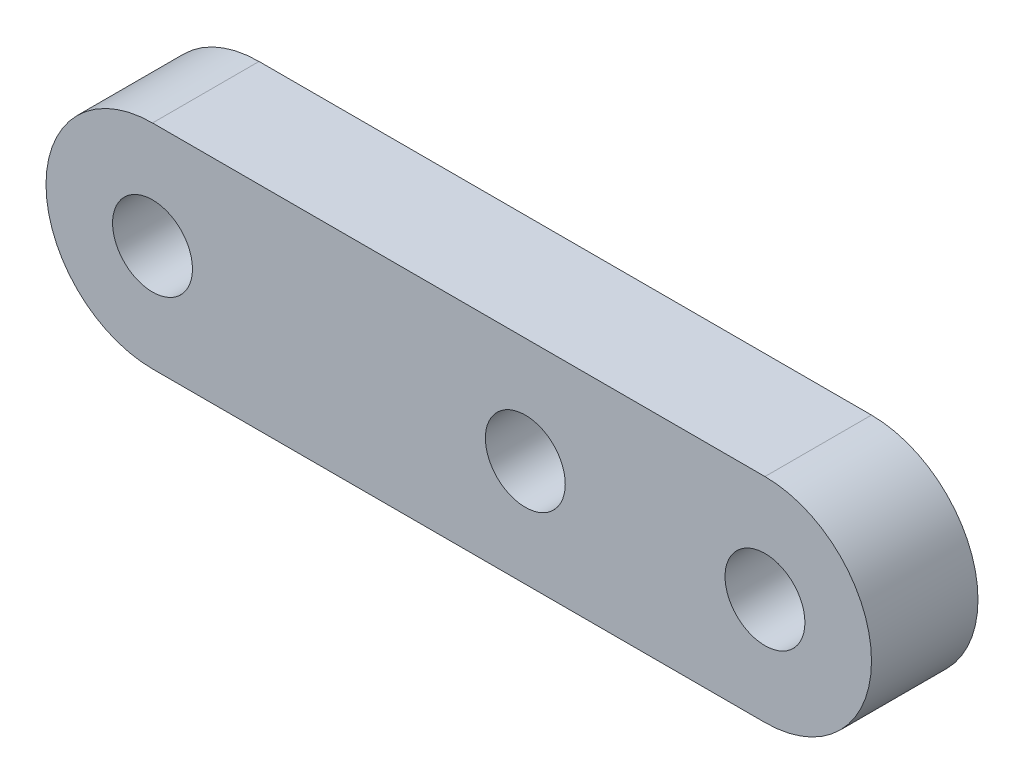
ISO-10303-21;
HEADER;
FILE_DESCRIPTION(('STEP AP214'),'2;1');
FILE_NAME('part.step','',(''),(''),'','','');
FILE_SCHEMA(('AUTOMOTIVE_DESIGN { 1 0 10303 214 1 1 1 1 }'));
ENDSEC;
DATA;
#1=APPLICATION_CONTEXT('core data for automotive mechanical design processes');
#2=APPLICATION_PROTOCOL_DEFINITION('international standard','automotive_design',2000,#1);
#3=PRODUCT_CONTEXT('',#1,'mechanical');
#4=PRODUCT('Part','Part','',(#3));
#5=PRODUCT_RELATED_PRODUCT_CATEGORY('part','',(#4));
#6=PRODUCT_DEFINITION_FORMATION('','',#4);
#7=PRODUCT_DEFINITION_CONTEXT('part definition',#1,'design');
#8=PRODUCT_DEFINITION('design','',#6,#7);
#9=PRODUCT_DEFINITION_SHAPE('','',#8);
#10=(LENGTH_UNIT() NAMED_UNIT(*) SI_UNIT(.MILLI.,.METRE.));
#11=(NAMED_UNIT(*) PLANE_ANGLE_UNIT() SI_UNIT($,.RADIAN.));
#12=(NAMED_UNIT(*) SI_UNIT($,.STERADIAN.) SOLID_ANGLE_UNIT());
#13=UNCERTAINTY_MEASURE_WITH_UNIT(LENGTH_MEASURE(1.E-05),#10,'distance_accuracy_value','');
#14=(GEOMETRIC_REPRESENTATION_CONTEXT(3) GLOBAL_UNCERTAINTY_ASSIGNED_CONTEXT((#13)) GLOBAL_UNIT_ASSIGNED_CONTEXT((#10,
#11,#12)) REPRESENTATION_CONTEXT('',''));
#15=CARTESIAN_POINT('',(0.,0.,0.));
#16=DIRECTION('',(0.,0.,1.));
#17=DIRECTION('',(1.,0.,0.));
#18=AXIS2_PLACEMENT_3D('',#15,#16,#17);
#19=CARTESIAN_POINT('',(0.,0.,4.));
#20=DIRECTION('',(0.,0.,1.));
#21=DIRECTION('',(1.,0.,0.));
#22=AXIS2_PLACEMENT_3D('',#19,#20,#21);
#23=PLANE('',#22);
#24=CARTESIAN_POINT('',(14.,0.,4.));
#25=DIRECTION('',(0.,0.,1.));
#26=DIRECTION('',(1.,0.,0.));
#27=AXIS2_PLACEMENT_3D('',#24,#25,#26);
#28=CIRCLE('',#27,1.5);
#29=CARTESIAN_POINT('',(15.5,0.,4.));
#30=VERTEX_POINT('',#29);
#31=EDGE_CURVE('E140',#30,#30,#28,.T.);
#32=ORIENTED_EDGE('',*,*,#31,.F.);
#33=EDGE_LOOP('',(#32));
#34=FACE_BOUND('',#33,.T.);
#35=CARTESIAN_POINT('',(0.,0.,4.));
#36=DIRECTION('',(0.,0.,1.));
#37=DIRECTION('',(1.,0.,0.));
#38=AXIS2_PLACEMENT_3D('',#35,#36,#37);
#39=CIRCLE('',#38,4.);
#40=CARTESIAN_POINT('',(0.,4.,4.));
#41=VERTEX_POINT('',#40);
#42=CARTESIAN_POINT('',(0.,-4.,4.));
#43=VERTEX_POINT('',#42);
#44=EDGE_CURVE('E98',#41,#43,#39,.T.);
#45=ORIENTED_EDGE('',*,*,#44,.T.);
#46=DIRECTION('',(1.,0.,0.));
#47=VECTOR('',#46,1.);
#48=CARTESIAN_POINT('',(0.,-4.,4.));
#49=LINE('',#48,#47);
#50=CARTESIAN_POINT('',(23.,-4.,4.));
#51=VERTEX_POINT('',#50);
#52=EDGE_CURVE('E93',#43,#51,#49,.T.);
#53=ORIENTED_EDGE('',*,*,#52,.T.);
#54=CARTESIAN_POINT('',(23.,0.,4.));
#55=DIRECTION('',(0.,0.,1.));
#56=DIRECTION('',(1.,0.,0.));
#57=AXIS2_PLACEMENT_3D('',#54,#55,#56);
#58=CIRCLE('',#57,4.);
#59=CARTESIAN_POINT('',(23.,4.,4.));
#60=VERTEX_POINT('',#59);
#61=EDGE_CURVE('E96',#51,#60,#58,.T.);
#62=ORIENTED_EDGE('',*,*,#61,.T.);
#63=DIRECTION('',(-1.,0.,0.));
#64=VECTOR('',#63,1.);
#65=CARTESIAN_POINT('',(0.,4.,4.));
#66=LINE('',#65,#64);
#67=EDGE_CURVE('E63',#60,#41,#66,.T.);
#68=ORIENTED_EDGE('',*,*,#67,.T.);
#69=EDGE_LOOP('',(#45,#53,#62,#68));
#70=FACE_BOUND('',#69,.T.);
#71=CARTESIAN_POINT('',(0.,0.,4.));
#72=DIRECTION('',(0.,0.,1.));
#73=DIRECTION('',(1.,0.,0.));
#74=AXIS2_PLACEMENT_3D('',#71,#72,#73);
#75=CIRCLE('',#74,1.5);
#76=CARTESIAN_POINT('',(1.5,0.,4.));
#77=VERTEX_POINT('',#76);
#78=EDGE_CURVE('E118',#77,#77,#75,.T.);
#79=ORIENTED_EDGE('',*,*,#78,.F.);
#80=EDGE_LOOP('',(#79));
#81=FACE_BOUND('',#80,.T.);
#82=CARTESIAN_POINT('',(23.,0.,4.));
#83=DIRECTION('',(0.,0.,1.));
#84=DIRECTION('',(1.,0.,0.));
#85=AXIS2_PLACEMENT_3D('',#82,#83,#84);
#86=CIRCLE('',#85,1.5);
#87=CARTESIAN_POINT('',(24.5,0.,4.));
#88=VERTEX_POINT('',#87);
#89=EDGE_CURVE('E148',#88,#88,#86,.T.);
#90=ORIENTED_EDGE('',*,*,#89,.F.);
#91=EDGE_LOOP('',(#90));
#92=FACE_BOUND('',#91,.T.);
#93=ADVANCED_FACE('F45',(#34,#70,#81,#92),#23,.T.);
#94=CARTESIAN_POINT('',(0.,0.,0.));
#95=DIRECTION('',(0.,0.,1.));
#96=DIRECTION('',(1.,0.,0.));
#97=AXIS2_PLACEMENT_3D('',#94,#95,#96);
#98=PLANE('',#97);
#99=CARTESIAN_POINT('',(0.,0.,0.));
#100=DIRECTION('',(0.,0.,1.));
#101=DIRECTION('',(1.,0.,0.));
#102=AXIS2_PLACEMENT_3D('',#99,#100,#101);
#103=CIRCLE('',#102,4.);
#104=CARTESIAN_POINT('',(0.,4.,0.));
#105=VERTEX_POINT('',#104);
#106=CARTESIAN_POINT('',(0.,-4.,0.));
#107=VERTEX_POINT('',#106);
#108=EDGE_CURVE('E114',#105,#107,#103,.T.);
#109=ORIENTED_EDGE('',*,*,#108,.F.);
#110=DIRECTION('',(-1.,0.,0.));
#111=VECTOR('',#110,1.);
#112=CARTESIAN_POINT('',(0.,4.,0.));
#113=LINE('',#112,#111);
#114=CARTESIAN_POINT('',(23.,4.,0.));
#115=VERTEX_POINT('',#114);
#116=EDGE_CURVE('E86',#115,#105,#113,.T.);
#117=ORIENTED_EDGE('',*,*,#116,.F.);
#118=CARTESIAN_POINT('',(23.,0.,0.));
#119=DIRECTION('',(0.,0.,1.));
#120=DIRECTION('',(1.,0.,0.));
#121=AXIS2_PLACEMENT_3D('',#118,#119,#120);
#122=CIRCLE('',#121,4.);
#123=CARTESIAN_POINT('',(23.,-4.,0.));
#124=VERTEX_POINT('',#123);
#125=EDGE_CURVE('E80',#124,#115,#122,.T.);
#126=ORIENTED_EDGE('',*,*,#125,.F.);
#127=DIRECTION('',(1.,0.,0.));
#128=VECTOR('',#127,1.);
#129=CARTESIAN_POINT('',(0.,-4.,0.));
#130=LINE('',#129,#128);
#131=EDGE_CURVE('E103',#107,#124,#130,.T.);
#132=ORIENTED_EDGE('',*,*,#131,.F.);
#133=EDGE_LOOP('',(#109,#117,#126,#132));
#134=FACE_BOUND('',#133,.T.);
#135=CARTESIAN_POINT('',(0.,0.,0.));
#136=DIRECTION('',(0.,0.,1.));
#137=DIRECTION('',(1.,0.,0.));
#138=AXIS2_PLACEMENT_3D('',#135,#136,#137);
#139=CIRCLE('',#138,1.5);
#140=CARTESIAN_POINT('',(1.5,0.,0.));
#141=VERTEX_POINT('',#140);
#142=EDGE_CURVE('E136',#141,#141,#139,.T.);
#143=ORIENTED_EDGE('',*,*,#142,.T.);
#144=EDGE_LOOP('',(#143));
#145=FACE_BOUND('',#144,.T.);
#146=CARTESIAN_POINT('',(14.,0.,0.));
#147=DIRECTION('',(0.,0.,1.));
#148=DIRECTION('',(1.,0.,0.));
#149=AXIS2_PLACEMENT_3D('',#146,#147,#148);
#150=CIRCLE('',#149,1.5);
#151=CARTESIAN_POINT('',(15.5,0.,0.));
#152=VERTEX_POINT('',#151);
#153=EDGE_CURVE('E144',#152,#152,#150,.T.);
#154=ORIENTED_EDGE('',*,*,#153,.T.);
#155=EDGE_LOOP('',(#154));
#156=FACE_BOUND('',#155,.T.);
#157=CARTESIAN_POINT('',(23.,0.,0.));
#158=DIRECTION('',(0.,0.,1.));
#159=DIRECTION('',(1.,0.,0.));
#160=AXIS2_PLACEMENT_3D('',#157,#158,#159);
#161=CIRCLE('',#160,1.5);
#162=CARTESIAN_POINT('',(24.5,0.,0.));
#163=VERTEX_POINT('',#162);
#164=EDGE_CURVE('E152',#163,#163,#161,.T.);
#165=ORIENTED_EDGE('',*,*,#164,.T.);
#166=EDGE_LOOP('',(#165));
#167=FACE_BOUND('',#166,.T.);
#168=ADVANCED_FACE('F131',(#134,#145,#156,#167),#98,.F.);
#169=CARTESIAN_POINT('',(0.,0.,4.));
#170=DIRECTION('',(0.,0.,-1.));
#171=DIRECTION('',(-1.,0.,0.));
#172=AXIS2_PLACEMENT_3D('',#169,#170,#171);
#173=CYLINDRICAL_SURFACE('',#172,4.);
#174=ORIENTED_EDGE('',*,*,#108,.T.);
#175=DIRECTION('',(0.,0.,-1.));
#176=VECTOR('',#175,1.);
#177=CARTESIAN_POINT('',(0.,-4.,4.));
#178=LINE('',#177,#176);
#179=EDGE_CURVE('E11',#43,#107,#178,.T.);
#180=ORIENTED_EDGE('',*,*,#179,.F.);
#181=ORIENTED_EDGE('',*,*,#44,.F.);
#182=DIRECTION('',(0.,0.,-1.));
#183=VECTOR('',#182,1.);
#184=CARTESIAN_POINT('',(0.,4.,4.));
#185=LINE('',#184,#183);
#186=EDGE_CURVE('E110',#41,#105,#185,.T.);
#187=ORIENTED_EDGE('',*,*,#186,.T.);
#188=EDGE_LOOP('',(#174,#180,#181,#187));
#189=FACE_BOUND('',#188,.T.);
#190=ADVANCED_FACE('F47',(#189),#173,.T.);
#191=CARTESIAN_POINT('',(0.,-4.,4.));
#192=DIRECTION('',(0.,1.,0.));
#193=DIRECTION('',(0.,0.,1.));
#194=AXIS2_PLACEMENT_3D('',#191,#192,#193);
#195=PLANE('',#194);
#196=ORIENTED_EDGE('',*,*,#131,.T.);
#197=DIRECTION('',(0.,0.,-1.));
#198=VECTOR('',#197,1.);
#199=CARTESIAN_POINT('',(23.,-4.,4.));
#200=LINE('',#199,#198);
#201=EDGE_CURVE('E55',#51,#124,#200,.T.);
#202=ORIENTED_EDGE('',*,*,#201,.F.);
#203=ORIENTED_EDGE('',*,*,#52,.F.);
#204=ORIENTED_EDGE('',*,*,#179,.T.);
#205=EDGE_LOOP('',(#196,#202,#203,#204));
#206=FACE_BOUND('',#205,.T.);
#207=ADVANCED_FACE('F102',(#206),#195,.F.);
#208=CARTESIAN_POINT('',(23.,0.,4.));
#209=DIRECTION('',(0.,0.,-1.));
#210=DIRECTION('',(-1.,0.,0.));
#211=AXIS2_PLACEMENT_3D('',#208,#209,#210);
#212=CYLINDRICAL_SURFACE('',#211,4.);
#213=ORIENTED_EDGE('',*,*,#125,.T.);
#214=DIRECTION('',(0.,0.,-1.));
#215=VECTOR('',#214,1.);
#216=CARTESIAN_POINT('',(23.,4.,4.));
#217=LINE('',#216,#215);
#218=EDGE_CURVE('E105',#60,#115,#217,.T.);
#219=ORIENTED_EDGE('',*,*,#218,.F.);
#220=ORIENTED_EDGE('',*,*,#61,.F.);
#221=ORIENTED_EDGE('',*,*,#201,.T.);
#222=EDGE_LOOP('',(#213,#219,#220,#221));
#223=FACE_BOUND('',#222,.T.);
#224=ADVANCED_FACE('F106',(#223),#212,.T.);
#225=CARTESIAN_POINT('',(0.,4.,4.));
#226=DIRECTION('',(0.,-1.,0.));
#227=DIRECTION('',(0.,0.,-1.));
#228=AXIS2_PLACEMENT_3D('',#225,#226,#227);
#229=PLANE('',#228);
#230=ORIENTED_EDGE('',*,*,#116,.T.);
#231=ORIENTED_EDGE('',*,*,#186,.F.);
#232=ORIENTED_EDGE('',*,*,#67,.F.);
#233=ORIENTED_EDGE('',*,*,#218,.T.);
#234=EDGE_LOOP('',(#230,#231,#232,#233));
#235=FACE_BOUND('',#234,.T.);
#236=ADVANCED_FACE('F128',(#235),#229,.F.);
#237=CARTESIAN_POINT('',(0.,0.,4.));
#238=DIRECTION('',(0.,0.,-1.));
#239=DIRECTION('',(-1.,0.,0.));
#240=AXIS2_PLACEMENT_3D('',#237,#238,#239);
#241=CYLINDRICAL_SURFACE('',#240,1.5);
#242=ORIENTED_EDGE('',*,*,#78,.T.);
#243=EDGE_LOOP('',(#242));
#244=FACE_BOUND('',#243,.T.);
#245=ORIENTED_EDGE('',*,*,#142,.F.);
#246=EDGE_LOOP('',(#245));
#247=FACE_BOUND('',#246,.T.);
#248=ADVANCED_FACE('F172',(#244,#247),#241,.F.);
#249=CARTESIAN_POINT('',(14.,0.,4.));
#250=DIRECTION('',(0.,0.,-1.));
#251=DIRECTION('',(-1.,0.,0.));
#252=AXIS2_PLACEMENT_3D('',#249,#250,#251);
#253=CYLINDRICAL_SURFACE('',#252,1.5);
#254=ORIENTED_EDGE('',*,*,#31,.T.);
#255=EDGE_LOOP('',(#254));
#256=FACE_BOUND('',#255,.T.);
#257=ORIENTED_EDGE('',*,*,#153,.F.);
#258=EDGE_LOOP('',(#257));
#259=FACE_BOUND('',#258,.T.);
#260=ADVANCED_FACE('F217',(#256,#259),#253,.F.);
#261=CARTESIAN_POINT('',(23.,0.,4.));
#262=DIRECTION('',(0.,0.,-1.));
#263=DIRECTION('',(-1.,0.,0.));
#264=AXIS2_PLACEMENT_3D('',#261,#262,#263);
#265=CYLINDRICAL_SURFACE('',#264,1.5);
#266=ORIENTED_EDGE('',*,*,#89,.T.);
#267=EDGE_LOOP('',(#266));
#268=FACE_BOUND('',#267,.T.);
#269=ORIENTED_EDGE('',*,*,#164,.F.);
#270=EDGE_LOOP('',(#269));
#271=FACE_BOUND('',#270,.T.);
#272=ADVANCED_FACE('F160',(#268,#271),#265,.F.);
#273=CLOSED_SHELL('',(#93,#168,#190,#207,#224,#236,#248,#260,#272));
#274=MANIFOLD_SOLID_BREP('B2',#273);
#275=ADVANCED_BREP_SHAPE_REPRESENTATION('',(#18,#274),#14);
#276=SHAPE_DEFINITION_REPRESENTATION(#9,#275);
ENDSEC;
END-ISO-10303-21;
